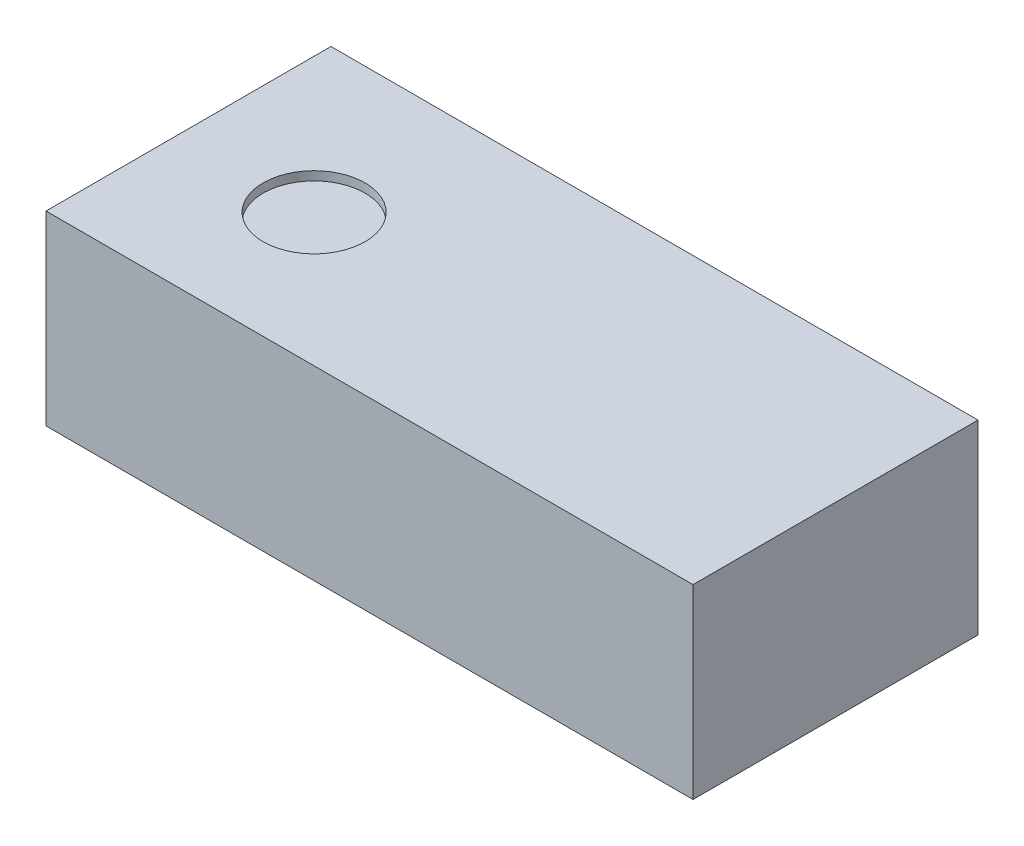
ISO-10303-21;
HEADER;
FILE_DESCRIPTION(('STEP AP214'),'2;1');
FILE_NAME('part.step','',(''),(''),'','','');
FILE_SCHEMA(('AUTOMOTIVE_DESIGN { 1 0 10303 214 1 1 1 1 }'));
ENDSEC;
DATA;
#1=APPLICATION_CONTEXT('core data for automotive mechanical design processes');
#2=APPLICATION_PROTOCOL_DEFINITION('international standard','automotive_design',2000,#1);
#3=PRODUCT_CONTEXT('',#1,'mechanical');
#4=PRODUCT('Part','Part','',(#3));
#5=PRODUCT_RELATED_PRODUCT_CATEGORY('part','',(#4));
#6=PRODUCT_DEFINITION_FORMATION('','',#4);
#7=PRODUCT_DEFINITION_CONTEXT('part definition',#1,'design');
#8=PRODUCT_DEFINITION('design','',#6,#7);
#9=PRODUCT_DEFINITION_SHAPE('','',#8);
#10=(LENGTH_UNIT() NAMED_UNIT(*) SI_UNIT(.MILLI.,.METRE.));
#11=(NAMED_UNIT(*) PLANE_ANGLE_UNIT() SI_UNIT($,.RADIAN.));
#12=(NAMED_UNIT(*) SI_UNIT($,.STERADIAN.) SOLID_ANGLE_UNIT());
#13=UNCERTAINTY_MEASURE_WITH_UNIT(LENGTH_MEASURE(1.E-05),#10,'distance_accuracy_value','');
#14=(GEOMETRIC_REPRESENTATION_CONTEXT(3) GLOBAL_UNCERTAINTY_ASSIGNED_CONTEXT((#13)) GLOBAL_UNIT_ASSIGNED_CONTEXT((#10,
#11,#12)) REPRESENTATION_CONTEXT('',''));
#15=CARTESIAN_POINT('',(0.,0.,0.));
#16=DIRECTION('',(0.,0.,1.));
#17=DIRECTION('',(1.,0.,0.));
#18=AXIS2_PLACEMENT_3D('',#15,#16,#17);
#19=CARTESIAN_POINT('',(36.5,21.,-16.075));
#20=DIRECTION('',(-1.,0.,0.));
#21=DIRECTION('',(0.,0.,1.));
#22=AXIS2_PLACEMENT_3D('',#19,#20,#21);
#23=PLANE('',#22);
#24=DIRECTION('',(0.,0.,-1.));
#25=VECTOR('',#24,1.);
#26=CARTESIAN_POINT('',(36.5,0.,-16.075));
#27=LINE('',#26,#25);
#28=CARTESIAN_POINT('',(36.5,0.,16.075));
#29=VERTEX_POINT('',#28);
#30=CARTESIAN_POINT('',(36.5,0.,-16.075));
#31=VERTEX_POINT('',#30);
#32=EDGE_CURVE('E113',#29,#31,#27,.T.);
#33=ORIENTED_EDGE('',*,*,#32,.T.);
#34=DIRECTION('',(0.,-1.,0.));
#35=VECTOR('',#34,1.);
#36=CARTESIAN_POINT('',(36.5,21.,-16.075));
#37=LINE('',#36,#35);
#38=CARTESIAN_POINT('',(36.5,21.,-16.075));
#39=VERTEX_POINT('',#38);
#40=EDGE_CURVE('E11',#39,#31,#37,.T.);
#41=ORIENTED_EDGE('',*,*,#40,.F.);
#42=DIRECTION('',(0.,0.,-1.));
#43=VECTOR('',#42,1.);
#44=CARTESIAN_POINT('',(36.5,21.,-16.075));
#45=LINE('',#44,#43);
#46=CARTESIAN_POINT('',(36.5,21.,16.075));
#47=VERTEX_POINT('',#46);
#48=EDGE_CURVE('E97',#47,#39,#45,.T.);
#49=ORIENTED_EDGE('',*,*,#48,.F.);
#50=DIRECTION('',(0.,-1.,0.));
#51=VECTOR('',#50,1.);
#52=CARTESIAN_POINT('',(36.5,21.,16.075));
#53=LINE('',#52,#51);
#54=EDGE_CURVE('E109',#47,#29,#53,.T.);
#55=ORIENTED_EDGE('',*,*,#54,.T.);
#56=EDGE_LOOP('',(#33,#41,#49,#55));
#57=FACE_BOUND('',#56,.T.);
#58=ADVANCED_FACE('F45',(#57),#23,.F.);
#59=CARTESIAN_POINT('',(-36.5,21.,-16.075));
#60=DIRECTION('',(0.,0.,1.));
#61=DIRECTION('',(1.,0.,0.));
#62=AXIS2_PLACEMENT_3D('',#59,#60,#61);
#63=PLANE('',#62);
#64=DIRECTION('',(-1.,0.,0.));
#65=VECTOR('',#64,1.);
#66=CARTESIAN_POINT('',(-36.5,0.,-16.075));
#67=LINE('',#66,#65);
#68=CARTESIAN_POINT('',(-36.5,0.,-16.075));
#69=VERTEX_POINT('',#68);
#70=EDGE_CURVE('E102',#31,#69,#67,.T.);
#71=ORIENTED_EDGE('',*,*,#70,.T.);
#72=DIRECTION('',(0.,-1.,0.));
#73=VECTOR('',#72,1.);
#74=CARTESIAN_POINT('',(-36.5,21.,-16.075));
#75=LINE('',#74,#73);
#76=CARTESIAN_POINT('',(-36.5,21.,-16.075));
#77=VERTEX_POINT('',#76);
#78=EDGE_CURVE('E54',#77,#69,#75,.T.);
#79=ORIENTED_EDGE('',*,*,#78,.F.);
#80=DIRECTION('',(-1.,0.,0.));
#81=VECTOR('',#80,1.);
#82=CARTESIAN_POINT('',(-36.5,21.,-16.075));
#83=LINE('',#82,#81);
#84=EDGE_CURVE('E92',#39,#77,#83,.T.);
#85=ORIENTED_EDGE('',*,*,#84,.F.);
#86=ORIENTED_EDGE('',*,*,#40,.T.);
#87=EDGE_LOOP('',(#71,#79,#85,#86));
#88=FACE_BOUND('',#87,.T.);
#89=ADVANCED_FACE('F101',(#88),#63,.F.);
#90=CARTESIAN_POINT('',(-36.5,21.,-16.075));
#91=DIRECTION('',(1.,0.,0.));
#92=DIRECTION('',(0.,0.,-1.));
#93=AXIS2_PLACEMENT_3D('',#90,#91,#92);
#94=PLANE('',#93);
#95=DIRECTION('',(0.,0.,1.));
#96=VECTOR('',#95,1.);
#97=CARTESIAN_POINT('',(-36.5,0.,-16.075));
#98=LINE('',#97,#96);
#99=CARTESIAN_POINT('',(-36.5,0.,16.075));
#100=VERTEX_POINT('',#99);
#101=EDGE_CURVE('E79',#69,#100,#98,.T.);
#102=ORIENTED_EDGE('',*,*,#101,.T.);
#103=DIRECTION('',(0.,-1.,0.));
#104=VECTOR('',#103,1.);
#105=CARTESIAN_POINT('',(-36.5,21.,16.075));
#106=LINE('',#105,#104);
#107=CARTESIAN_POINT('',(-36.5,21.,16.075));
#108=VERTEX_POINT('',#107);
#109=EDGE_CURVE('E104',#108,#100,#106,.T.);
#110=ORIENTED_EDGE('',*,*,#109,.F.);
#111=DIRECTION('',(0.,0.,1.));
#112=VECTOR('',#111,1.);
#113=CARTESIAN_POINT('',(-36.5,21.,-16.075));
#114=LINE('',#113,#112);
#115=EDGE_CURVE('E95',#77,#108,#114,.T.);
#116=ORIENTED_EDGE('',*,*,#115,.F.);
#117=ORIENTED_EDGE('',*,*,#78,.T.);
#118=EDGE_LOOP('',(#102,#110,#116,#117));
#119=FACE_BOUND('',#118,.T.);
#120=ADVANCED_FACE('F105',(#119),#94,.F.);
#121=CARTESIAN_POINT('',(-36.5,21.,16.075));
#122=DIRECTION('',(0.,0.,-1.));
#123=DIRECTION('',(-1.,0.,0.));
#124=AXIS2_PLACEMENT_3D('',#121,#122,#123);
#125=PLANE('',#124);
#126=DIRECTION('',(1.,0.,0.));
#127=VECTOR('',#126,1.);
#128=CARTESIAN_POINT('',(-36.5,0.,16.075));
#129=LINE('',#128,#127);
#130=EDGE_CURVE('E85',#100,#29,#129,.T.);
#131=ORIENTED_EDGE('',*,*,#130,.T.);
#132=ORIENTED_EDGE('',*,*,#54,.F.);
#133=DIRECTION('',(1.,0.,0.));
#134=VECTOR('',#133,1.);
#135=CARTESIAN_POINT('',(-36.5,21.,16.075));
#136=LINE('',#135,#134);
#137=EDGE_CURVE('E62',#108,#47,#136,.T.);
#138=ORIENTED_EDGE('',*,*,#137,.F.);
#139=ORIENTED_EDGE('',*,*,#109,.T.);
#140=EDGE_LOOP('',(#131,#132,#138,#139));
#141=FACE_BOUND('',#140,.T.);
#142=ADVANCED_FACE('F127',(#141),#125,.F.);
#143=CARTESIAN_POINT('',(0.,21.,0.));
#144=DIRECTION('',(0.,1.,0.));
#145=DIRECTION('',(0.,0.,1.));
#146=AXIS2_PLACEMENT_3D('',#143,#144,#145);
#147=PLANE('',#146);
#148=CARTESIAN_POINT('',(-21.25,21.,1.075));
#149=DIRECTION('',(0.,1.,0.));
#150=DIRECTION('',(0.,0.,1.));
#151=AXIS2_PLACEMENT_3D('',#148,#149,#150);
#152=CIRCLE('',#151,5.75);
#153=CARTESIAN_POINT('',(-21.25,21.,6.825));
#154=VERTEX_POINT('',#153);
#155=EDGE_CURVE('E134',#154,#154,#152,.T.);
#156=ORIENTED_EDGE('',*,*,#155,.F.);
#157=EDGE_LOOP('',(#156));
#158=FACE_BOUND('',#157,.T.);
#159=ORIENTED_EDGE('',*,*,#48,.T.);
#160=ORIENTED_EDGE('',*,*,#84,.T.);
#161=ORIENTED_EDGE('',*,*,#115,.T.);
#162=ORIENTED_EDGE('',*,*,#137,.T.);
#163=EDGE_LOOP('',(#159,#160,#161,#162));
#164=FACE_BOUND('',#163,.T.);
#165=ADVANCED_FACE('F93',(#158,#164),#147,.T.);
#166=CARTESIAN_POINT('',(0.,0.,0.));
#167=DIRECTION('',(0.,1.,0.));
#168=DIRECTION('',(0.,0.,1.));
#169=AXIS2_PLACEMENT_3D('',#166,#167,#168);
#170=PLANE('',#169);
#171=ORIENTED_EDGE('',*,*,#32,.F.);
#172=ORIENTED_EDGE('',*,*,#130,.F.);
#173=ORIENTED_EDGE('',*,*,#101,.F.);
#174=ORIENTED_EDGE('',*,*,#70,.F.);
#175=EDGE_LOOP('',(#171,#172,#173,#174));
#176=FACE_BOUND('',#175,.T.);
#177=ADVANCED_FACE('F130',(#176),#170,.F.);
#178=CARTESIAN_POINT('',(-21.25,20.,1.075));
#179=DIRECTION('',(0.,1.,0.));
#180=DIRECTION('',(0.,0.,1.));
#181=AXIS2_PLACEMENT_3D('',#178,#179,#180);
#182=CYLINDRICAL_SURFACE('',#181,5.75);
#183=CARTESIAN_POINT('',(-21.25,20.,1.075));
#184=DIRECTION('',(0.,1.,0.));
#185=DIRECTION('',(0.,0.,1.));
#186=AXIS2_PLACEMENT_3D('',#183,#184,#185);
#187=CIRCLE('',#186,5.75);
#188=CARTESIAN_POINT('',(-21.25,20.,6.825));
#189=VERTEX_POINT('',#188);
#190=EDGE_CURVE('E117',#189,#189,#187,.T.);
#191=ORIENTED_EDGE('',*,*,#190,.F.);
#192=EDGE_LOOP('',(#191));
#193=FACE_BOUND('',#192,.T.);
#194=ORIENTED_EDGE('',*,*,#155,.T.);
#195=EDGE_LOOP('',(#194));
#196=FACE_BOUND('',#195,.T.);
#197=ADVANCED_FACE('F144',(#193,#196),#182,.F.);
#198=CARTESIAN_POINT('',(-21.25,20.,1.075));
#199=DIRECTION('',(0.,1.,0.));
#200=DIRECTION('',(0.,0.,1.));
#201=AXIS2_PLACEMENT_3D('',#198,#199,#200);
#202=PLANE('',#201);
#203=ORIENTED_EDGE('',*,*,#190,.T.);
#204=EDGE_LOOP('',(#203));
#205=FACE_BOUND('',#204,.T.);
#206=ADVANCED_FACE('F142',(#205),#202,.T.);
#207=CLOSED_SHELL('',(#58,#89,#120,#142,#165,#177,#197,#206));
#208=MANIFOLD_SOLID_BREP('B2',#207);
#209=ADVANCED_BREP_SHAPE_REPRESENTATION('',(#18,#208),#14);
#210=SHAPE_DEFINITION_REPRESENTATION(#9,#209);
ENDSEC;
END-ISO-10303-21;
